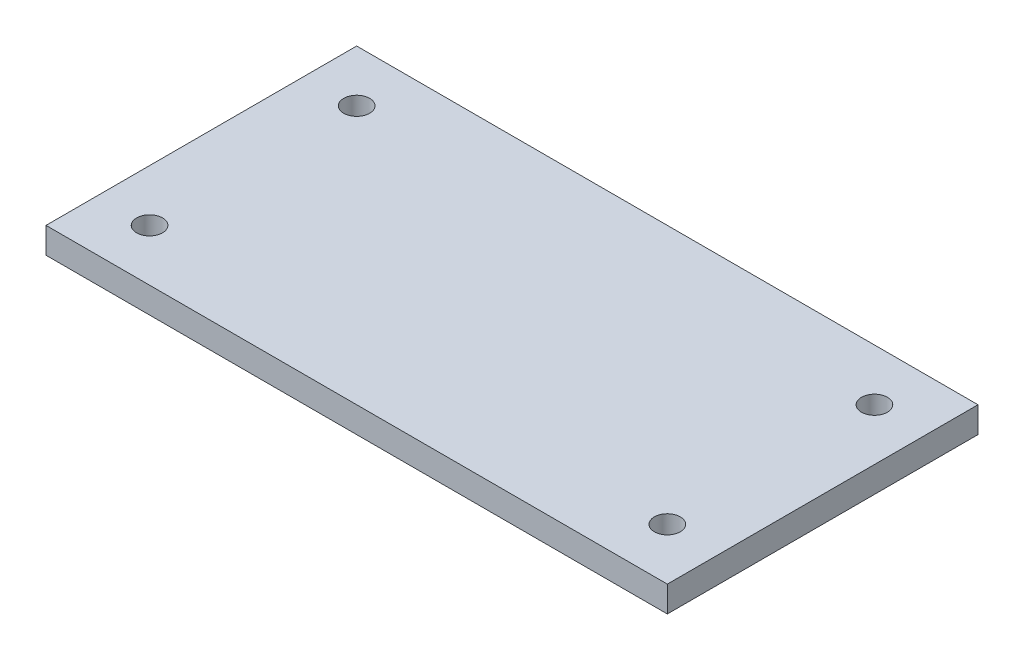
ISO-10303-21;
HEADER;
FILE_DESCRIPTION(('STEP AP214'),'2;1');
FILE_NAME('part.step','',(''),(''),'','','');
FILE_SCHEMA(('AUTOMOTIVE_DESIGN { 1 0 10303 214 1 1 1 1 }'));
ENDSEC;
DATA;
#1=APPLICATION_CONTEXT('core data for automotive mechanical design processes');
#2=APPLICATION_PROTOCOL_DEFINITION('international standard','automotive_design',2000,#1);
#3=PRODUCT_CONTEXT('',#1,'mechanical');
#4=PRODUCT('Part','Part','',(#3));
#5=PRODUCT_RELATED_PRODUCT_CATEGORY('part','',(#4));
#6=PRODUCT_DEFINITION_FORMATION('','',#4);
#7=PRODUCT_DEFINITION_CONTEXT('part definition',#1,'design');
#8=PRODUCT_DEFINITION('design','',#6,#7);
#9=PRODUCT_DEFINITION_SHAPE('','',#8);
#10=(LENGTH_UNIT() NAMED_UNIT(*) SI_UNIT(.MILLI.,.METRE.));
#11=(NAMED_UNIT(*) PLANE_ANGLE_UNIT() SI_UNIT($,.RADIAN.));
#12=(NAMED_UNIT(*) SI_UNIT($,.STERADIAN.) SOLID_ANGLE_UNIT());
#13=UNCERTAINTY_MEASURE_WITH_UNIT(LENGTH_MEASURE(1.E-05),#10,'distance_accuracy_value','');
#14=(GEOMETRIC_REPRESENTATION_CONTEXT(3) GLOBAL_UNCERTAINTY_ASSIGNED_CONTEXT((#13)) GLOBAL_UNIT_ASSIGNED_CONTEXT((#10,
#11,#12)) REPRESENTATION_CONTEXT('',''));
#15=CARTESIAN_POINT('',(0.,0.,0.));
#16=DIRECTION('',(0.,0.,1.));
#17=DIRECTION('',(1.,0.,0.));
#18=AXIS2_PLACEMENT_3D('',#15,#16,#17);
#19=CARTESIAN_POINT('',(0.,6.35,0.));
#20=DIRECTION('',(0.,-1.,0.));
#21=DIRECTION('',(0.,0.,-1.));
#22=AXIS2_PLACEMENT_3D('',#19,#20,#21);
#23=PLANE('',#22);
#24=DIRECTION('',(0.,0.,-1.));
#25=VECTOR('',#24,1.);
#26=CARTESIAN_POINT('',(76.2,6.35,38.1));
#27=LINE('',#26,#25);
#28=CARTESIAN_POINT('',(76.2,6.35,38.1));
#29=VERTEX_POINT('',#28);
#30=CARTESIAN_POINT('',(76.2,6.35,-38.1));
#31=VERTEX_POINT('',#30);
#32=EDGE_CURVE('E85',#29,#31,#27,.T.);
#33=ORIENTED_EDGE('',*,*,#32,.T.);
#34=DIRECTION('',(-1.,0.,0.));
#35=VECTOR('',#34,1.);
#36=CARTESIAN_POINT('',(-76.2,6.35,-38.1));
#37=LINE('',#36,#35);
#38=CARTESIAN_POINT('',(-76.2,6.35,-38.1));
#39=VERTEX_POINT('',#38);
#40=EDGE_CURVE('E80',#31,#39,#37,.T.);
#41=ORIENTED_EDGE('',*,*,#40,.T.);
#42=DIRECTION('',(0.,0.,1.));
#43=VECTOR('',#42,1.);
#44=CARTESIAN_POINT('',(-76.2,6.35,38.1));
#45=LINE('',#44,#43);
#46=CARTESIAN_POINT('',(-76.2,6.35,38.1));
#47=VERTEX_POINT('',#46);
#48=EDGE_CURVE('E83',#39,#47,#45,.T.);
#49=ORIENTED_EDGE('',*,*,#48,.T.);
#50=DIRECTION('',(1.,0.,0.));
#51=VECTOR('',#50,1.);
#52=CARTESIAN_POINT('',(-76.2,6.35,38.1));
#53=LINE('',#52,#51);
#54=EDGE_CURVE('E50',#47,#29,#53,.T.);
#55=ORIENTED_EDGE('',*,*,#54,.T.);
#56=EDGE_LOOP('',(#33,#41,#49,#55));
#57=FACE_BOUND('',#56,.T.);
#58=CARTESIAN_POINT('',(-63.5,6.35,-25.4));
#59=DIRECTION('',(0.,1.,0.));
#60=DIRECTION('',(0.,0.,1.));
#61=AXIS2_PLACEMENT_3D('',#58,#59,#60);
#62=CIRCLE('',#61,3.18262);
#63=CARTESIAN_POINT('',(-63.5,6.35,-22.21738));
#64=VERTEX_POINT('',#63);
#65=EDGE_CURVE('E100',#64,#64,#62,.T.);
#66=ORIENTED_EDGE('',*,*,#65,.F.);
#67=EDGE_LOOP('',(#66));
#68=FACE_BOUND('',#67,.T.);
#69=CARTESIAN_POINT('',(63.5,6.35,-25.4));
#70=DIRECTION('',(0.,1.,0.));
#71=DIRECTION('',(0.,0.,1.));
#72=AXIS2_PLACEMENT_3D('',#69,#70,#71);
#73=CIRCLE('',#72,3.18262);
#74=CARTESIAN_POINT('',(63.5,6.35,-22.21738));
#75=VERTEX_POINT('',#74);
#76=EDGE_CURVE('E115',#75,#75,#73,.T.);
#77=ORIENTED_EDGE('',*,*,#76,.F.);
#78=EDGE_LOOP('',(#77));
#79=FACE_BOUND('',#78,.T.);
#80=CARTESIAN_POINT('',(63.5,6.35,25.4));
#81=DIRECTION('',(0.,1.,0.));
#82=DIRECTION('',(0.,0.,1.));
#83=AXIS2_PLACEMENT_3D('',#80,#81,#82);
#84=CIRCLE('',#83,3.18262);
#85=CARTESIAN_POINT('',(63.5,6.35,28.58262));
#86=VERTEX_POINT('',#85);
#87=EDGE_CURVE('E121',#86,#86,#84,.T.);
#88=ORIENTED_EDGE('',*,*,#87,.F.);
#89=EDGE_LOOP('',(#88));
#90=FACE_BOUND('',#89,.T.);
#91=CARTESIAN_POINT('',(-63.5,6.35,25.4));
#92=DIRECTION('',(0.,1.,0.));
#93=DIRECTION('',(0.,0.,1.));
#94=AXIS2_PLACEMENT_3D('',#91,#92,#93);
#95=CIRCLE('',#94,3.18262);
#96=CARTESIAN_POINT('',(-63.5,6.35,28.58262));
#97=VERTEX_POINT('',#96);
#98=EDGE_CURVE('E127',#97,#97,#95,.T.);
#99=ORIENTED_EDGE('',*,*,#98,.F.);
#100=EDGE_LOOP('',(#99));
#101=FACE_BOUND('',#100,.T.);
#102=ADVANCED_FACE('F33',(#57,#68,#79,#90,#101),#23,.F.);
#103=CARTESIAN_POINT('',(0.,0.,0.));
#104=DIRECTION('',(0.,-1.,0.));
#105=DIRECTION('',(0.,0.,-1.));
#106=AXIS2_PLACEMENT_3D('',#103,#104,#105);
#107=PLANE('',#106);
#108=CARTESIAN_POINT('',(63.5,0.,25.4));
#109=DIRECTION('',(0.,1.,0.));
#110=DIRECTION('',(0.,0.,1.));
#111=AXIS2_PLACEMENT_3D('',#108,#109,#110);
#112=CIRCLE('',#111,3.18262);
#113=CARTESIAN_POINT('',(63.5,0.,28.58262));
#114=VERTEX_POINT('',#113);
#115=EDGE_CURVE('E124',#114,#114,#112,.T.);
#116=ORIENTED_EDGE('',*,*,#115,.T.);
#117=EDGE_LOOP('',(#116));
#118=FACE_BOUND('',#117,.T.);
#119=CARTESIAN_POINT('',(-63.5,0.,-25.4));
#120=DIRECTION('',(0.,1.,0.));
#121=DIRECTION('',(0.,0.,1.));
#122=AXIS2_PLACEMENT_3D('',#119,#120,#121);
#123=CIRCLE('',#122,3.18262);
#124=CARTESIAN_POINT('',(-63.5,0.,-22.21738));
#125=VERTEX_POINT('',#124);
#126=EDGE_CURVE('E112',#125,#125,#123,.T.);
#127=ORIENTED_EDGE('',*,*,#126,.T.);
#128=EDGE_LOOP('',(#127));
#129=FACE_BOUND('',#128,.T.);
#130=DIRECTION('',(0.,0.,-1.));
#131=VECTOR('',#130,1.);
#132=CARTESIAN_POINT('',(76.2,0.,38.1));
#133=LINE('',#132,#131);
#134=CARTESIAN_POINT('',(76.2,0.,38.1));
#135=VERTEX_POINT('',#134);
#136=CARTESIAN_POINT('',(76.2,0.,-38.1));
#137=VERTEX_POINT('',#136);
#138=EDGE_CURVE('E97',#135,#137,#133,.T.);
#139=ORIENTED_EDGE('',*,*,#138,.F.);
#140=DIRECTION('',(1.,0.,0.));
#141=VECTOR('',#140,1.);
#142=CARTESIAN_POINT('',(-76.2,0.,38.1));
#143=LINE('',#142,#141);
#144=CARTESIAN_POINT('',(-76.2,0.,38.1));
#145=VERTEX_POINT('',#144);
#146=EDGE_CURVE('E73',#145,#135,#143,.T.);
#147=ORIENTED_EDGE('',*,*,#146,.F.);
#148=DIRECTION('',(0.,0.,1.));
#149=VECTOR('',#148,1.);
#150=CARTESIAN_POINT('',(-76.2,0.,38.1));
#151=LINE('',#150,#149);
#152=CARTESIAN_POINT('',(-76.2,0.,-38.1));
#153=VERTEX_POINT('',#152);
#154=EDGE_CURVE('E67',#153,#145,#151,.T.);
#155=ORIENTED_EDGE('',*,*,#154,.F.);
#156=DIRECTION('',(-1.,0.,0.));
#157=VECTOR('',#156,1.);
#158=CARTESIAN_POINT('',(-76.2,0.,-38.1));
#159=LINE('',#158,#157);
#160=EDGE_CURVE('E89',#137,#153,#159,.T.);
#161=ORIENTED_EDGE('',*,*,#160,.F.);
#162=EDGE_LOOP('',(#139,#147,#155,#161));
#163=FACE_BOUND('',#162,.T.);
#164=CARTESIAN_POINT('',(63.5,0.,-25.4));
#165=DIRECTION('',(0.,1.,0.));
#166=DIRECTION('',(0.,0.,1.));
#167=AXIS2_PLACEMENT_3D('',#164,#165,#166);
#168=CIRCLE('',#167,3.18262);
#169=CARTESIAN_POINT('',(63.5,0.,-22.21738));
#170=VERTEX_POINT('',#169);
#171=EDGE_CURVE('E118',#170,#170,#168,.T.);
#172=ORIENTED_EDGE('',*,*,#171,.T.);
#173=EDGE_LOOP('',(#172));
#174=FACE_BOUND('',#173,.T.);
#175=CARTESIAN_POINT('',(-63.5,0.,25.4));
#176=DIRECTION('',(0.,1.,0.));
#177=DIRECTION('',(0.,0.,1.));
#178=AXIS2_PLACEMENT_3D('',#175,#176,#177);
#179=CIRCLE('',#178,3.18262);
#180=CARTESIAN_POINT('',(-63.5,0.,28.58262));
#181=VERTEX_POINT('',#180);
#182=EDGE_CURVE('E130',#181,#181,#179,.T.);
#183=ORIENTED_EDGE('',*,*,#182,.T.);
#184=EDGE_LOOP('',(#183));
#185=FACE_BOUND('',#184,.T.);
#186=ADVANCED_FACE('F108',(#118,#129,#163,#174,#185),#107,.T.);
#187=CARTESIAN_POINT('',(76.2,6.35,38.1));
#188=DIRECTION('',(-1.,0.,0.));
#189=DIRECTION('',(0.,0.,1.));
#190=AXIS2_PLACEMENT_3D('',#187,#188,#189);
#191=PLANE('',#190);
#192=ORIENTED_EDGE('',*,*,#138,.T.);
#193=DIRECTION('',(0.,-1.,0.));
#194=VECTOR('',#193,1.);
#195=CARTESIAN_POINT('',(76.2,6.35,-38.1));
#196=LINE('',#195,#194);
#197=EDGE_CURVE('E11',#31,#137,#196,.T.);
#198=ORIENTED_EDGE('',*,*,#197,.F.);
#199=ORIENTED_EDGE('',*,*,#32,.F.);
#200=DIRECTION('',(0.,-1.,0.));
#201=VECTOR('',#200,1.);
#202=CARTESIAN_POINT('',(76.2,6.35,38.1));
#203=LINE('',#202,#201);
#204=EDGE_CURVE('E93',#29,#135,#203,.T.);
#205=ORIENTED_EDGE('',*,*,#204,.T.);
#206=EDGE_LOOP('',(#192,#198,#199,#205));
#207=FACE_BOUND('',#206,.T.);
#208=ADVANCED_FACE('F35',(#207),#191,.F.);
#209=CARTESIAN_POINT('',(-76.2,6.35,-38.1));
#210=DIRECTION('',(0.,0.,1.));
#211=DIRECTION('',(1.,0.,0.));
#212=AXIS2_PLACEMENT_3D('',#209,#210,#211);
#213=PLANE('',#212);
#214=ORIENTED_EDGE('',*,*,#160,.T.);
#215=DIRECTION('',(0.,-1.,0.));
#216=VECTOR('',#215,1.);
#217=CARTESIAN_POINT('',(-76.2,6.35,-38.1));
#218=LINE('',#217,#216);
#219=EDGE_CURVE('E42',#39,#153,#218,.T.);
#220=ORIENTED_EDGE('',*,*,#219,.F.);
#221=ORIENTED_EDGE('',*,*,#40,.F.);
#222=ORIENTED_EDGE('',*,*,#197,.T.);
#223=EDGE_LOOP('',(#214,#220,#221,#222));
#224=FACE_BOUND('',#223,.T.);
#225=ADVANCED_FACE('F88',(#224),#213,.F.);
#226=CARTESIAN_POINT('',(-76.2,6.35,38.1));
#227=DIRECTION('',(1.,0.,0.));
#228=DIRECTION('',(0.,0.,-1.));
#229=AXIS2_PLACEMENT_3D('',#226,#227,#228);
#230=PLANE('',#229);
#231=ORIENTED_EDGE('',*,*,#154,.T.);
#232=DIRECTION('',(0.,-1.,0.));
#233=VECTOR('',#232,1.);
#234=CARTESIAN_POINT('',(-76.2,6.35,38.1));
#235=LINE('',#234,#233);
#236=EDGE_CURVE('E90',#47,#145,#235,.T.);
#237=ORIENTED_EDGE('',*,*,#236,.F.);
#238=ORIENTED_EDGE('',*,*,#48,.F.);
#239=ORIENTED_EDGE('',*,*,#219,.T.);
#240=EDGE_LOOP('',(#231,#237,#238,#239));
#241=FACE_BOUND('',#240,.T.);
#242=ADVANCED_FACE('F91',(#241),#230,.F.);
#243=CARTESIAN_POINT('',(-76.2,6.35,38.1));
#244=DIRECTION('',(0.,0.,-1.));
#245=DIRECTION('',(-1.,0.,0.));
#246=AXIS2_PLACEMENT_3D('',#243,#244,#245);
#247=PLANE('',#246);
#248=ORIENTED_EDGE('',*,*,#146,.T.);
#249=ORIENTED_EDGE('',*,*,#204,.F.);
#250=ORIENTED_EDGE('',*,*,#54,.F.);
#251=ORIENTED_EDGE('',*,*,#236,.T.);
#252=EDGE_LOOP('',(#248,#249,#250,#251));
#253=FACE_BOUND('',#252,.T.);
#254=ADVANCED_FACE('F105',(#253),#247,.F.);
#255=CARTESIAN_POINT('',(-63.5,6.35,-25.4));
#256=DIRECTION('',(0.,-1.,0.));
#257=DIRECTION('',(0.,0.,-1.));
#258=AXIS2_PLACEMENT_3D('',#255,#256,#257);
#259=CYLINDRICAL_SURFACE('',#258,3.18262);
#260=ORIENTED_EDGE('',*,*,#65,.T.);
#261=EDGE_LOOP('',(#260));
#262=FACE_BOUND('',#261,.T.);
#263=ORIENTED_EDGE('',*,*,#126,.F.);
#264=EDGE_LOOP('',(#263));
#265=FACE_BOUND('',#264,.T.);
#266=ADVANCED_FACE('F147',(#262,#265),#259,.F.);
#267=CARTESIAN_POINT('',(63.5,6.35,-25.4));
#268=DIRECTION('',(0.,-1.,0.));
#269=DIRECTION('',(0.,0.,-1.));
#270=AXIS2_PLACEMENT_3D('',#267,#268,#269);
#271=CYLINDRICAL_SURFACE('',#270,3.18262);
#272=ORIENTED_EDGE('',*,*,#76,.T.);
#273=EDGE_LOOP('',(#272));
#274=FACE_BOUND('',#273,.T.);
#275=ORIENTED_EDGE('',*,*,#171,.F.);
#276=EDGE_LOOP('',(#275));
#277=FACE_BOUND('',#276,.T.);
#278=ADVANCED_FACE('F193',(#274,#277),#271,.F.);
#279=CARTESIAN_POINT('',(63.5,6.35,25.4));
#280=DIRECTION('',(0.,-1.,0.));
#281=DIRECTION('',(0.,0.,-1.));
#282=AXIS2_PLACEMENT_3D('',#279,#280,#281);
#283=CYLINDRICAL_SURFACE('',#282,3.18262);
#284=ORIENTED_EDGE('',*,*,#87,.T.);
#285=EDGE_LOOP('',(#284));
#286=FACE_BOUND('',#285,.T.);
#287=ORIENTED_EDGE('',*,*,#115,.F.);
#288=EDGE_LOOP('',(#287));
#289=FACE_BOUND('',#288,.T.);
#290=ADVANCED_FACE('F201',(#286,#289),#283,.F.);
#291=CARTESIAN_POINT('',(-63.5,6.35,25.4));
#292=DIRECTION('',(0.,-1.,0.));
#293=DIRECTION('',(0.,0.,-1.));
#294=AXIS2_PLACEMENT_3D('',#291,#292,#293);
#295=CYLINDRICAL_SURFACE('',#294,3.18262);
#296=ORIENTED_EDGE('',*,*,#98,.T.);
#297=EDGE_LOOP('',(#296));
#298=FACE_BOUND('',#297,.T.);
#299=ORIENTED_EDGE('',*,*,#182,.F.);
#300=EDGE_LOOP('',(#299));
#301=FACE_BOUND('',#300,.T.);
#302=ADVANCED_FACE('F136',(#298,#301),#295,.F.);
#303=CLOSED_SHELL('',(#102,#186,#208,#225,#242,#254,#266,#278,#290,#302));
#304=MANIFOLD_SOLID_BREP('B2',#303);
#305=ADVANCED_BREP_SHAPE_REPRESENTATION('',(#18,#304),#14);
#306=SHAPE_DEFINITION_REPRESENTATION(#9,#305);
ENDSEC;
END-ISO-10303-21;
